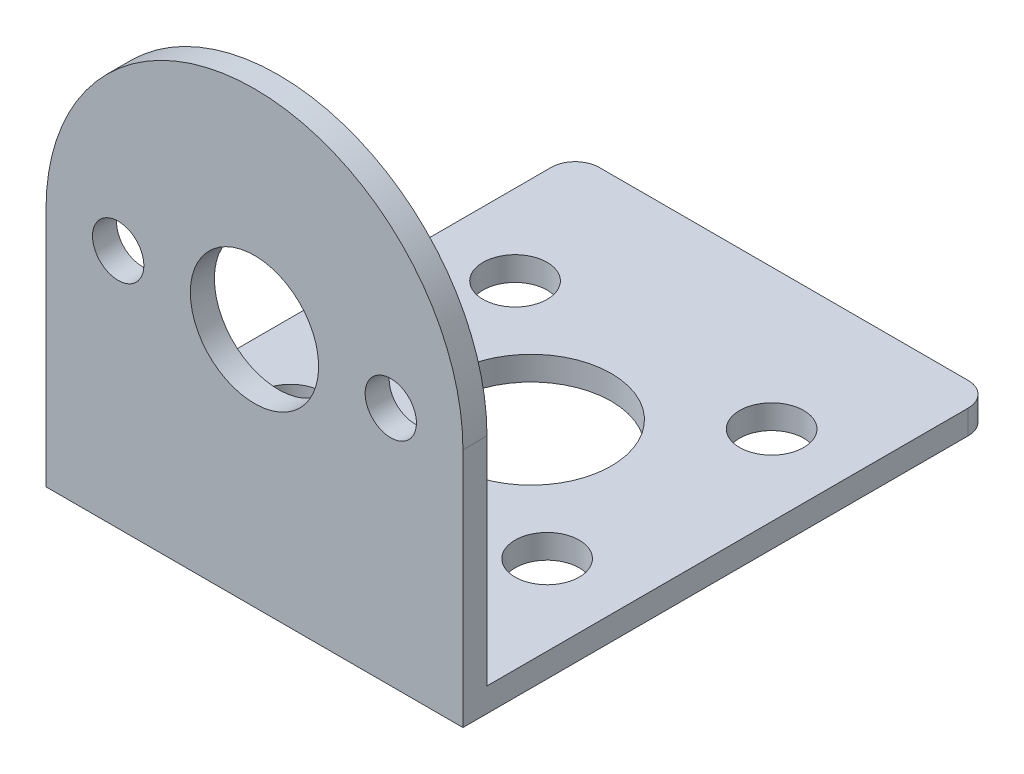
ISO-10303-21;
HEADER;
FILE_DESCRIPTION(('STEP AP214'),'2;1');
FILE_NAME('part.step','',(''),(''),'','','');
FILE_SCHEMA(('AUTOMOTIVE_DESIGN { 1 0 10303 214 1 1 1 1 }'));
ENDSEC;
DATA;
#1=APPLICATION_CONTEXT('core data for automotive mechanical design processes');
#2=APPLICATION_PROTOCOL_DEFINITION('international standard','automotive_design',2000,#1);
#3=PRODUCT_CONTEXT('',#1,'mechanical');
#4=PRODUCT('Part','Part','',(#3));
#5=PRODUCT_RELATED_PRODUCT_CATEGORY('part','',(#4));
#6=PRODUCT_DEFINITION_FORMATION('','',#4);
#7=PRODUCT_DEFINITION_CONTEXT('part definition',#1,'design');
#8=PRODUCT_DEFINITION('design','',#6,#7);
#9=PRODUCT_DEFINITION_SHAPE('','',#8);
#10=(LENGTH_UNIT() NAMED_UNIT(*) SI_UNIT(.MILLI.,.METRE.));
#11=(NAMED_UNIT(*) PLANE_ANGLE_UNIT() SI_UNIT($,.RADIAN.));
#12=(NAMED_UNIT(*) SI_UNIT($,.STERADIAN.) SOLID_ANGLE_UNIT());
#13=UNCERTAINTY_MEASURE_WITH_UNIT(LENGTH_MEASURE(1.E-05),#10,'distance_accuracy_value','');
#14=(GEOMETRIC_REPRESENTATION_CONTEXT(3) GLOBAL_UNCERTAINTY_ASSIGNED_CONTEXT((#13)) GLOBAL_UNIT_ASSIGNED_CONTEXT((#10,
#11,#12)) REPRESENTATION_CONTEXT('',''));
#15=CARTESIAN_POINT('',(0.,0.,0.));
#16=DIRECTION('',(0.,0.,1.));
#17=DIRECTION('',(1.,0.,0.));
#18=AXIS2_PLACEMENT_3D('',#15,#16,#17);
#19=CARTESIAN_POINT('',(13.,15.,0.));
#20=DIRECTION('',(0.,0.,1.));
#21=DIRECTION('',(1.,0.,0.));
#22=AXIS2_PLACEMENT_3D('',#19,#20,#21);
#23=PLANE('',#22);
#24=CARTESIAN_POINT('',(21.5,15.,0.));
#25=DIRECTION('',(0.,0.,-1.));
#26=DIRECTION('',(-1.,0.,0.));
#27=AXIS2_PLACEMENT_3D('',#24,#25,#26);
#28=CIRCLE('',#27,1.6);
#29=CARTESIAN_POINT('',(19.9,15.,0.));
#30=VERTEX_POINT('',#29);
#31=EDGE_CURVE('E146',#30,#30,#28,.T.);
#32=ORIENTED_EDGE('',*,*,#31,.F.);
#33=EDGE_LOOP('',(#32));
#34=FACE_BOUND('',#33,.T.);
#35=CARTESIAN_POINT('',(13.,15.,0.));
#36=DIRECTION('',(0.,0.,-1.));
#37=DIRECTION('',(-1.,0.,0.));
#38=AXIS2_PLACEMENT_3D('',#35,#36,#37);
#39=CIRCLE('',#38,4.);
#40=CARTESIAN_POINT('',(9.,15.,0.));
#41=VERTEX_POINT('',#40);
#42=EDGE_CURVE('E159',#41,#41,#39,.T.);
#43=ORIENTED_EDGE('',*,*,#42,.F.);
#44=EDGE_LOOP('',(#43));
#45=FACE_BOUND('',#44,.T.);
#46=CARTESIAN_POINT('',(4.5,15.,0.));
#47=DIRECTION('',(0.,0.,-1.));
#48=DIRECTION('',(-1.,0.,0.));
#49=AXIS2_PLACEMENT_3D('',#46,#47,#48);
#50=CIRCLE('',#49,1.6);
#51=CARTESIAN_POINT('',(2.9,15.,0.));
#52=VERTEX_POINT('',#51);
#53=EDGE_CURVE('E151',#52,#52,#50,.T.);
#54=ORIENTED_EDGE('',*,*,#53,.F.);
#55=EDGE_LOOP('',(#54));
#56=FACE_BOUND('',#55,.T.);
#57=DIRECTION('',(1.,0.,0.));
#58=VECTOR('',#57,1.);
#59=CARTESIAN_POINT('',(26.,1.5,0.));
#60=LINE('',#59,#58);
#61=CARTESIAN_POINT('',(0.,1.5,0.));
#62=VERTEX_POINT('',#61);
#63=CARTESIAN_POINT('',(26.,1.5,0.));
#64=VERTEX_POINT('',#63);
#65=EDGE_CURVE('E124',#62,#64,#60,.T.);
#66=ORIENTED_EDGE('',*,*,#65,.F.);
#67=DIRECTION('',(0.,-1.,0.));
#68=VECTOR('',#67,1.);
#69=CARTESIAN_POINT('',(0.,0.,0.));
#70=LINE('',#69,#68);
#71=CARTESIAN_POINT('',(0.,15.,0.));
#72=VERTEX_POINT('',#71);
#73=EDGE_CURVE('E128',#72,#62,#70,.T.);
#74=ORIENTED_EDGE('',*,*,#73,.F.);
#75=CARTESIAN_POINT('',(13.,15.,0.));
#76=DIRECTION('',(0.,0.,1.));
#77=DIRECTION('',(1.,0.,0.));
#78=AXIS2_PLACEMENT_3D('',#75,#76,#77);
#79=CIRCLE('',#78,13.);
#80=CARTESIAN_POINT('',(26.,15.,0.));
#81=VERTEX_POINT('',#80);
#82=EDGE_CURVE('E126',#81,#72,#79,.T.);
#83=ORIENTED_EDGE('',*,*,#82,.F.);
#84=DIRECTION('',(0.,1.,0.));
#85=VECTOR('',#84,1.);
#86=CARTESIAN_POINT('',(26.,0.,0.));
#87=LINE('',#86,#85);
#88=EDGE_CURVE('E112',#64,#81,#87,.T.);
#89=ORIENTED_EDGE('',*,*,#88,.F.);
#90=EDGE_LOOP('',(#66,#74,#83,#89));
#91=FACE_BOUND('',#90,.T.);
#92=ADVANCED_FACE('F45',(#34,#45,#56,#91),#23,.F.);
#93=CARTESIAN_POINT('',(0.,0.,1.5));
#94=DIRECTION('',(1.,0.,0.));
#95=DIRECTION('',(0.,0.,-1.));
#96=AXIS2_PLACEMENT_3D('',#93,#94,#95);
#97=PLANE('',#96);
#98=DIRECTION('',(0.,0.,1.));
#99=VECTOR('',#98,1.);
#100=CARTESIAN_POINT('',(0.,1.5,-31.5));
#101=LINE('',#100,#99);
#102=CARTESIAN_POINT('',(0.,1.5,-30.));
#103=VERTEX_POINT('',#102);
#104=EDGE_CURVE('E117',#103,#62,#101,.T.);
#105=ORIENTED_EDGE('',*,*,#104,.F.);
#106=DIRECTION('',(0.,1.,0.));
#107=VECTOR('',#106,1.);
#108=CARTESIAN_POINT('',(0.,0.,-30.));
#109=LINE('',#108,#107);
#110=CARTESIAN_POINT('',(0.,0.,-30.));
#111=VERTEX_POINT('',#110);
#112=EDGE_CURVE('E11',#103,#111,#109,.F.);
#113=ORIENTED_EDGE('',*,*,#112,.T.);
#114=DIRECTION('',(0.,0.,-1.));
#115=VECTOR('',#114,1.);
#116=CARTESIAN_POINT('',(0.,0.,1.5));
#117=LINE('',#116,#115);
#118=CARTESIAN_POINT('',(0.,0.,1.5));
#119=VERTEX_POINT('',#118);
#120=EDGE_CURVE('E197',#119,#111,#117,.T.);
#121=ORIENTED_EDGE('',*,*,#120,.F.);
#122=DIRECTION('',(0.,-1.,0.));
#123=VECTOR('',#122,1.);
#124=CARTESIAN_POINT('',(0.,0.,1.5));
#125=LINE('',#124,#123);
#126=CARTESIAN_POINT('',(0.,15.,1.5));
#127=VERTEX_POINT('',#126);
#128=EDGE_CURVE('E170',#127,#119,#125,.T.);
#129=ORIENTED_EDGE('',*,*,#128,.F.);
#130=DIRECTION('',(0.,0.,-1.));
#131=VECTOR('',#130,1.);
#132=CARTESIAN_POINT('',(0.,15.,1.5));
#133=LINE('',#132,#131);
#134=EDGE_CURVE('E183',#127,#72,#133,.T.);
#135=ORIENTED_EDGE('',*,*,#134,.T.);
#136=ORIENTED_EDGE('',*,*,#73,.T.);
#137=EDGE_LOOP('',(#105,#113,#121,#129,#135,#136));
#138=FACE_BOUND('',#137,.T.);
#139=ADVANCED_FACE('F258',(#138),#97,.F.);
#140=CARTESIAN_POINT('',(0.,0.,1.5));
#141=DIRECTION('',(0.,1.,0.));
#142=DIRECTION('',(0.,0.,1.));
#143=AXIS2_PLACEMENT_3D('',#140,#141,#142);
#144=PLANE('',#143);
#145=CARTESIAN_POINT('',(5.,0.,-22.75));
#146=DIRECTION('',(0.,-1.,0.));
#147=DIRECTION('',(0.,0.,1.));
#148=AXIS2_PLACEMENT_3D('',#145,#146,#147);
#149=CIRCLE('',#148,2.);
#150=CARTESIAN_POINT('',(5.,0.,-24.75));
#151=VERTEX_POINT('',#150);
#152=EDGE_CURVE('E342',#151,#151,#149,.T.);
#153=ORIENTED_EDGE('',*,*,#152,.F.);
#154=EDGE_LOOP('',(#153));
#155=FACE_BOUND('',#154,.T.);
#156=CARTESIAN_POINT('',(13.,0.,-15.75));
#157=DIRECTION('',(0.,-1.,0.));
#158=DIRECTION('',(0.,0.,-1.));
#159=AXIS2_PLACEMENT_3D('',#156,#157,#158);
#160=CIRCLE('',#159,5.);
#161=CARTESIAN_POINT('',(13.,0.,-20.75));
#162=VERTEX_POINT('',#161);
#163=EDGE_CURVE('E336',#162,#162,#160,.T.);
#164=ORIENTED_EDGE('',*,*,#163,.F.);
#165=EDGE_LOOP('',(#164));
#166=FACE_BOUND('',#165,.T.);
#167=CARTESIAN_POINT('',(21.,0.,-22.75));
#168=DIRECTION('',(0.,-1.,0.));
#169=DIRECTION('',(0.,0.,1.));
#170=AXIS2_PLACEMENT_3D('',#167,#168,#169);
#171=CIRCLE('',#170,2.);
#172=CARTESIAN_POINT('',(21.,0.,-24.75));
#173=VERTEX_POINT('',#172);
#174=EDGE_CURVE('E329',#173,#173,#171,.T.);
#175=ORIENTED_EDGE('',*,*,#174,.F.);
#176=EDGE_LOOP('',(#175));
#177=FACE_BOUND('',#176,.T.);
#178=CARTESIAN_POINT('',(21.,0.,-8.75));
#179=DIRECTION('',(0.,-1.,0.));
#180=DIRECTION('',(0.,0.,-1.));
#181=AXIS2_PLACEMENT_3D('',#178,#179,#180);
#182=CIRCLE('',#181,2.);
#183=CARTESIAN_POINT('',(21.,0.,-10.75));
#184=VERTEX_POINT('',#183);
#185=EDGE_CURVE('E321',#184,#184,#182,.T.);
#186=ORIENTED_EDGE('',*,*,#185,.F.);
#187=EDGE_LOOP('',(#186));
#188=FACE_BOUND('',#187,.T.);
#189=CARTESIAN_POINT('',(5.,0.,-8.75));
#190=DIRECTION('',(0.,-1.,0.));
#191=DIRECTION('',(0.,0.,-1.));
#192=AXIS2_PLACEMENT_3D('',#189,#190,#191);
#193=CIRCLE('',#192,2.);
#194=CARTESIAN_POINT('',(5.,0.,-10.75));
#195=VERTEX_POINT('',#194);
#196=EDGE_CURVE('E207',#195,#195,#193,.T.);
#197=ORIENTED_EDGE('',*,*,#196,.F.);
#198=EDGE_LOOP('',(#197));
#199=FACE_BOUND('',#198,.T.);
#200=DIRECTION('',(-1.,0.,0.));
#201=VECTOR('',#200,1.);
#202=CARTESIAN_POINT('',(26.,0.,-31.5));
#203=LINE('',#202,#201);
#204=CARTESIAN_POINT('',(24.5,0.,-31.5));
#205=VERTEX_POINT('',#204);
#206=CARTESIAN_POINT('',(1.5,0.,-31.5));
#207=VERTEX_POINT('',#206);
#208=EDGE_CURVE('E132',#205,#207,#203,.T.);
#209=ORIENTED_EDGE('',*,*,#208,.F.);
#210=CARTESIAN_POINT('',(24.5,0.,-30.));
#211=DIRECTION('',(0.,1.,0.));
#212=DIRECTION('',(0.,0.,1.));
#213=AXIS2_PLACEMENT_3D('',#210,#211,#212);
#214=CIRCLE('',#213,1.5);
#215=CARTESIAN_POINT('',(26.,0.,-30.));
#216=VERTEX_POINT('',#215);
#217=EDGE_CURVE('E228',#205,#216,#214,.F.);
#218=ORIENTED_EDGE('',*,*,#217,.T.);
#219=DIRECTION('',(0.,0.,-1.));
#220=VECTOR('',#219,1.);
#221=CARTESIAN_POINT('',(26.,0.,1.5));
#222=LINE('',#221,#220);
#223=CARTESIAN_POINT('',(26.,0.,1.5));
#224=VERTEX_POINT('',#223);
#225=EDGE_CURVE('E194',#224,#216,#222,.T.);
#226=ORIENTED_EDGE('',*,*,#225,.F.);
#227=DIRECTION('',(1.,0.,0.));
#228=VECTOR('',#227,1.);
#229=CARTESIAN_POINT('',(0.,0.,1.5));
#230=LINE('',#229,#228);
#231=EDGE_CURVE('E174',#119,#224,#230,.T.);
#232=ORIENTED_EDGE('',*,*,#231,.F.);
#233=ORIENTED_EDGE('',*,*,#120,.T.);
#234=CARTESIAN_POINT('',(1.5,0.,-30.));
#235=DIRECTION('',(0.,1.,0.));
#236=DIRECTION('',(0.,0.,1.));
#237=AXIS2_PLACEMENT_3D('',#234,#235,#236);
#238=CIRCLE('',#237,1.5);
#239=EDGE_CURVE('E225',#111,#207,#238,.F.);
#240=ORIENTED_EDGE('',*,*,#239,.T.);
#241=EDGE_LOOP('',(#209,#218,#226,#232,#233,#240));
#242=FACE_BOUND('',#241,.T.);
#243=ADVANCED_FACE('F246',(#155,#166,#177,#188,#199,#242),#144,.F.);
#244=CARTESIAN_POINT('',(26.,0.,1.5));
#245=DIRECTION('',(-1.,0.,0.));
#246=DIRECTION('',(0.,0.,1.));
#247=AXIS2_PLACEMENT_3D('',#244,#245,#246);
#248=PLANE('',#247);
#249=ORIENTED_EDGE('',*,*,#225,.T.);
#250=DIRECTION('',(0.,-1.,0.));
#251=VECTOR('',#250,1.);
#252=CARTESIAN_POINT('',(26.,0.,-30.));
#253=LINE('',#252,#251);
#254=CARTESIAN_POINT('',(26.,1.5,-30.));
#255=VERTEX_POINT('',#254);
#256=EDGE_CURVE('E69',#216,#255,#253,.F.);
#257=ORIENTED_EDGE('',*,*,#256,.T.);
#258=DIRECTION('',(0.,0.,1.));
#259=VECTOR('',#258,1.);
#260=CARTESIAN_POINT('',(26.,1.5,-31.5));
#261=LINE('',#260,#259);
#262=EDGE_CURVE('E108',#255,#64,#261,.T.);
#263=ORIENTED_EDGE('',*,*,#262,.T.);
#264=ORIENTED_EDGE('',*,*,#88,.T.);
#265=DIRECTION('',(0.,0.,-1.));
#266=VECTOR('',#265,1.);
#267=CARTESIAN_POINT('',(26.,15.,1.5));
#268=LINE('',#267,#266);
#269=CARTESIAN_POINT('',(26.,15.,1.5));
#270=VERTEX_POINT('',#269);
#271=EDGE_CURVE('E191',#270,#81,#268,.T.);
#272=ORIENTED_EDGE('',*,*,#271,.F.);
#273=DIRECTION('',(0.,1.,0.));
#274=VECTOR('',#273,1.);
#275=CARTESIAN_POINT('',(26.,0.,1.5));
#276=LINE('',#275,#274);
#277=EDGE_CURVE('E177',#224,#270,#276,.T.);
#278=ORIENTED_EDGE('',*,*,#277,.F.);
#279=EDGE_LOOP('',(#249,#257,#263,#264,#272,#278));
#280=FACE_BOUND('',#279,.T.);
#281=ADVANCED_FACE('F110',(#280),#248,.F.);
#282=CARTESIAN_POINT('',(13.,15.,1.5));
#283=DIRECTION('',(0.,0.,-1.));
#284=DIRECTION('',(-1.,0.,0.));
#285=AXIS2_PLACEMENT_3D('',#282,#283,#284);
#286=CYLINDRICAL_SURFACE('',#285,13.);
#287=ORIENTED_EDGE('',*,*,#82,.T.);
#288=ORIENTED_EDGE('',*,*,#134,.F.);
#289=CARTESIAN_POINT('',(13.,15.,1.5));
#290=DIRECTION('',(0.,0.,1.));
#291=DIRECTION('',(1.,0.,0.));
#292=AXIS2_PLACEMENT_3D('',#289,#290,#291);
#293=CIRCLE('',#292,13.);
#294=EDGE_CURVE('E180',#270,#127,#293,.T.);
#295=ORIENTED_EDGE('',*,*,#294,.F.);
#296=ORIENTED_EDGE('',*,*,#271,.T.);
#297=EDGE_LOOP('',(#287,#288,#295,#296));
#298=FACE_BOUND('',#297,.T.);
#299=ADVANCED_FACE('F260',(#298),#286,.T.);
#300=CARTESIAN_POINT('',(13.,15.,1.5));
#301=DIRECTION('',(0.,0.,1.));
#302=DIRECTION('',(1.,0.,0.));
#303=AXIS2_PLACEMENT_3D('',#300,#301,#302);
#304=PLANE('',#303);
#305=CARTESIAN_POINT('',(4.5,15.,1.5));
#306=DIRECTION('',(0.,0.,-1.));
#307=DIRECTION('',(-1.,0.,0.));
#308=AXIS2_PLACEMENT_3D('',#305,#306,#307);
#309=CIRCLE('',#308,1.6);
#310=CARTESIAN_POINT('',(2.9,15.,1.5));
#311=VERTEX_POINT('',#310);
#312=EDGE_CURVE('E147',#311,#311,#309,.T.);
#313=ORIENTED_EDGE('',*,*,#312,.T.);
#314=EDGE_LOOP('',(#313));
#315=FACE_BOUND('',#314,.T.);
#316=CARTESIAN_POINT('',(13.,15.,1.5));
#317=DIRECTION('',(0.,0.,-1.));
#318=DIRECTION('',(-1.,0.,0.));
#319=AXIS2_PLACEMENT_3D('',#316,#317,#318);
#320=CIRCLE('',#319,4.);
#321=CARTESIAN_POINT('',(9.,15.,1.5));
#322=VERTEX_POINT('',#321);
#323=EDGE_CURVE('E155',#322,#322,#320,.T.);
#324=ORIENTED_EDGE('',*,*,#323,.T.);
#325=EDGE_LOOP('',(#324));
#326=FACE_BOUND('',#325,.T.);
#327=CARTESIAN_POINT('',(21.5,15.,1.5));
#328=DIRECTION('',(0.,0.,-1.));
#329=DIRECTION('',(-1.,0.,0.));
#330=AXIS2_PLACEMENT_3D('',#327,#328,#329);
#331=CIRCLE('',#330,1.6);
#332=CARTESIAN_POINT('',(19.9,15.,1.5));
#333=VERTEX_POINT('',#332);
#334=EDGE_CURVE('E163',#333,#333,#331,.T.);
#335=ORIENTED_EDGE('',*,*,#334,.T.);
#336=EDGE_LOOP('',(#335));
#337=FACE_BOUND('',#336,.T.);
#338=ORIENTED_EDGE('',*,*,#128,.T.);
#339=ORIENTED_EDGE('',*,*,#231,.T.);
#340=ORIENTED_EDGE('',*,*,#277,.T.);
#341=ORIENTED_EDGE('',*,*,#294,.T.);
#342=EDGE_LOOP('',(#338,#339,#340,#341));
#343=FACE_BOUND('',#342,.T.);
#344=ADVANCED_FACE('F250',(#315,#326,#337,#343),#304,.T.);
#345=CARTESIAN_POINT('',(21.5,15.,1.5));
#346=DIRECTION('',(0.,0.,-1.));
#347=DIRECTION('',(-1.,0.,0.));
#348=AXIS2_PLACEMENT_3D('',#345,#346,#347);
#349=CYLINDRICAL_SURFACE('',#348,1.6);
#350=ORIENTED_EDGE('',*,*,#334,.F.);
#351=EDGE_LOOP('',(#350));
#352=FACE_BOUND('',#351,.T.);
#353=ORIENTED_EDGE('',*,*,#31,.T.);
#354=EDGE_LOOP('',(#353));
#355=FACE_BOUND('',#354,.T.);
#356=ADVANCED_FACE('F267',(#352,#355),#349,.F.);
#357=CARTESIAN_POINT('',(13.,15.,1.5));
#358=DIRECTION('',(0.,0.,-1.));
#359=DIRECTION('',(-1.,0.,0.));
#360=AXIS2_PLACEMENT_3D('',#357,#358,#359);
#361=CYLINDRICAL_SURFACE('',#360,4.);
#362=ORIENTED_EDGE('',*,*,#323,.F.);
#363=EDGE_LOOP('',(#362));
#364=FACE_BOUND('',#363,.T.);
#365=ORIENTED_EDGE('',*,*,#42,.T.);
#366=EDGE_LOOP('',(#365));
#367=FACE_BOUND('',#366,.T.);
#368=ADVANCED_FACE('F283',(#364,#367),#361,.F.);
#369=CARTESIAN_POINT('',(4.5,15.,1.5));
#370=DIRECTION('',(0.,0.,-1.));
#371=DIRECTION('',(-1.,0.,0.));
#372=AXIS2_PLACEMENT_3D('',#369,#370,#371);
#373=CYLINDRICAL_SURFACE('',#372,1.6);
#374=ORIENTED_EDGE('',*,*,#312,.F.);
#375=EDGE_LOOP('',(#374));
#376=FACE_BOUND('',#375,.T.);
#377=ORIENTED_EDGE('',*,*,#53,.T.);
#378=EDGE_LOOP('',(#377));
#379=FACE_BOUND('',#378,.T.);
#380=ADVANCED_FACE('F287',(#376,#379),#373,.F.);
#381=CARTESIAN_POINT('',(26.,1.5,-31.5));
#382=DIRECTION('',(0.,-1.,0.));
#383=DIRECTION('',(1.,0.,0.));
#384=AXIS2_PLACEMENT_3D('',#381,#382,#383);
#385=PLANE('',#384);
#386=CARTESIAN_POINT('',(5.,1.5,-22.75));
#387=DIRECTION('',(0.,-1.,0.));
#388=DIRECTION('',(1.,0.,0.));
#389=AXIS2_PLACEMENT_3D('',#386,#387,#388);
#390=CIRCLE('',#389,2.);
#391=CARTESIAN_POINT('',(5.,1.5,-24.75));
#392=VERTEX_POINT('',#391);
#393=EDGE_CURVE('E133',#392,#392,#390,.T.);
#394=ORIENTED_EDGE('',*,*,#393,.T.);
#395=EDGE_LOOP('',(#394));
#396=FACE_BOUND('',#395,.T.);
#397=CARTESIAN_POINT('',(13.,1.5,-15.75));
#398=DIRECTION('',(0.,-1.,0.));
#399=DIRECTION('',(1.,0.,0.));
#400=AXIS2_PLACEMENT_3D('',#397,#398,#399);
#401=CIRCLE('',#400,5.);
#402=CARTESIAN_POINT('',(13.,1.5,-20.75));
#403=VERTEX_POINT('',#402);
#404=EDGE_CURVE('E140',#403,#403,#401,.T.);
#405=ORIENTED_EDGE('',*,*,#404,.T.);
#406=EDGE_LOOP('',(#405));
#407=FACE_BOUND('',#406,.T.);
#408=CARTESIAN_POINT('',(21.,1.5,-22.75));
#409=DIRECTION('',(0.,-1.,0.));
#410=DIRECTION('',(1.,0.,0.));
#411=AXIS2_PLACEMENT_3D('',#408,#409,#410);
#412=CIRCLE('',#411,2.);
#413=CARTESIAN_POINT('',(21.,1.5,-24.75));
#414=VERTEX_POINT('',#413);
#415=EDGE_CURVE('E211',#414,#414,#412,.T.);
#416=ORIENTED_EDGE('',*,*,#415,.T.);
#417=EDGE_LOOP('',(#416));
#418=FACE_BOUND('',#417,.T.);
#419=CARTESIAN_POINT('',(21.,1.5,-8.75));
#420=DIRECTION('',(0.,-1.,0.));
#421=DIRECTION('',(1.,0.,0.));
#422=AXIS2_PLACEMENT_3D('',#419,#420,#421);
#423=CIRCLE('',#422,2.);
#424=CARTESIAN_POINT('',(21.,1.5,-10.75));
#425=VERTEX_POINT('',#424);
#426=EDGE_CURVE('E206',#425,#425,#423,.T.);
#427=ORIENTED_EDGE('',*,*,#426,.T.);
#428=EDGE_LOOP('',(#427));
#429=FACE_BOUND('',#428,.T.);
#430=CARTESIAN_POINT('',(5.,1.5,-8.75));
#431=DIRECTION('',(0.,-1.,0.));
#432=DIRECTION('',(1.,0.,0.));
#433=AXIS2_PLACEMENT_3D('',#430,#431,#432);
#434=CIRCLE('',#433,2.);
#435=CARTESIAN_POINT('',(5.,1.5,-10.75));
#436=VERTEX_POINT('',#435);
#437=EDGE_CURVE('E202',#436,#436,#434,.T.);
#438=ORIENTED_EDGE('',*,*,#437,.T.);
#439=EDGE_LOOP('',(#438));
#440=FACE_BOUND('',#439,.T.);
#441=ORIENTED_EDGE('',*,*,#262,.F.);
#442=CARTESIAN_POINT('',(24.5,1.5,-30.));
#443=DIRECTION('',(0.,-1.,0.));
#444=DIRECTION('',(1.,0.,0.));
#445=AXIS2_PLACEMENT_3D('',#442,#443,#444);
#446=CIRCLE('',#445,1.5);
#447=CARTESIAN_POINT('',(24.5,1.5,-31.5));
#448=VERTEX_POINT('',#447);
#449=EDGE_CURVE('E54',#255,#448,#446,.F.);
#450=ORIENTED_EDGE('',*,*,#449,.T.);
#451=DIRECTION('',(1.,0.,0.));
#452=VECTOR('',#451,1.);
#453=CARTESIAN_POINT('',(26.,1.5,-31.5));
#454=LINE('',#453,#452);
#455=CARTESIAN_POINT('',(1.5,1.5,-31.5));
#456=VERTEX_POINT('',#455);
#457=EDGE_CURVE('E118',#456,#448,#454,.T.);
#458=ORIENTED_EDGE('',*,*,#457,.F.);
#459=CARTESIAN_POINT('',(1.5,1.5,-30.));
#460=DIRECTION('',(0.,-1.,0.));
#461=DIRECTION('',(1.,0.,0.));
#462=AXIS2_PLACEMENT_3D('',#459,#460,#461);
#463=CIRCLE('',#462,1.5);
#464=EDGE_CURVE('E61',#456,#103,#463,.F.);
#465=ORIENTED_EDGE('',*,*,#464,.T.);
#466=ORIENTED_EDGE('',*,*,#104,.T.);
#467=ORIENTED_EDGE('',*,*,#65,.T.);
#468=EDGE_LOOP('',(#441,#450,#458,#465,#466,#467));
#469=FACE_BOUND('',#468,.T.);
#470=ADVANCED_FACE('F130',(#396,#407,#418,#429,#440,#469),#385,.F.);
#471=CARTESIAN_POINT('',(0.,0.,-31.5));
#472=DIRECTION('',(0.,0.,1.));
#473=DIRECTION('',(1.,0.,0.));
#474=AXIS2_PLACEMENT_3D('',#471,#472,#473);
#475=PLANE('',#474);
#476=ORIENTED_EDGE('',*,*,#457,.T.);
#477=DIRECTION('',(0.,-1.,0.));
#478=VECTOR('',#477,1.);
#479=CARTESIAN_POINT('',(24.5,0.,-31.5));
#480=LINE('',#479,#478);
#481=EDGE_CURVE('E221',#448,#205,#480,.T.);
#482=ORIENTED_EDGE('',*,*,#481,.T.);
#483=ORIENTED_EDGE('',*,*,#208,.T.);
#484=DIRECTION('',(0.,1.,0.));
#485=VECTOR('',#484,1.);
#486=CARTESIAN_POINT('',(1.5,0.,-31.5));
#487=LINE('',#486,#485);
#488=EDGE_CURVE('E201',#207,#456,#487,.T.);
#489=ORIENTED_EDGE('',*,*,#488,.T.);
#490=EDGE_LOOP('',(#476,#482,#483,#489));
#491=FACE_BOUND('',#490,.T.);
#492=ADVANCED_FACE('F239',(#491),#475,.F.);
#493=CARTESIAN_POINT('',(5.,28.,-8.75));
#494=DIRECTION('',(0.,-1.,0.));
#495=DIRECTION('',(0.,0.,-1.));
#496=AXIS2_PLACEMENT_3D('',#493,#494,#495);
#497=CYLINDRICAL_SURFACE('',#496,2.);
#498=CARTESIAN_POINT('',(5.,0.,-10.75));
#499=CARTESIAN_POINT('',(5.,0.0156250000000041,-10.75));
#500=CARTESIAN_POINT('',(5.,0.0312500000000046,-10.75));
#501=CARTESIAN_POINT('',(5.,0.0625000000000047,-10.75));
#502=CARTESIAN_POINT('',(5.,0.0781250000000041,-10.75));
#503=CARTESIAN_POINT('',(5.,0.109375000000003,-10.75));
#504=CARTESIAN_POINT('',(5.,0.125000000000002,-10.75));
#505=CARTESIAN_POINT('',(5.,0.156250000000002,-10.75));
#506=CARTESIAN_POINT('',(5.,0.171875000000003,-10.75));
#507=CARTESIAN_POINT('',(5.,0.203125000000004,-10.75));
#508=CARTESIAN_POINT('',(5.,0.218750000000005,-10.75));
#509=CARTESIAN_POINT('',(5.,0.250000000000005,-10.75));
#510=CARTESIAN_POINT('',(5.,0.265625000000004,-10.75));
#511=CARTESIAN_POINT('',(5.,0.296875000000003,-10.75));
#512=CARTESIAN_POINT('',(5.,0.312500000000003,-10.75));
#513=CARTESIAN_POINT('',(5.,0.343750000000003,-10.75));
#514=CARTESIAN_POINT('',(5.,0.359375000000003,-10.75));
#515=CARTESIAN_POINT('',(5.,0.390625000000004,-10.75));
#516=CARTESIAN_POINT('',(5.,0.406250000000005,-10.75));
#517=CARTESIAN_POINT('',(5.,0.437500000000005,-10.75));
#518=CARTESIAN_POINT('',(5.,0.453125000000004,-10.75));
#519=CARTESIAN_POINT('',(5.,0.484375000000003,-10.75));
#520=CARTESIAN_POINT('',(5.,0.500000000000003,-10.75));
#521=CARTESIAN_POINT('',(5.,0.531250000000003,-10.75));
#522=CARTESIAN_POINT('',(5.,0.546875000000003,-10.75));
#523=CARTESIAN_POINT('',(5.,0.578125000000005,-10.75));
#524=CARTESIAN_POINT('',(5.,0.593750000000005,-10.75));
#525=CARTESIAN_POINT('',(5.,0.625000000000005,-10.75));
#526=CARTESIAN_POINT('',(5.,0.640625000000005,-10.75));
#527=CARTESIAN_POINT('',(5.,0.671875000000004,-10.75));
#528=CARTESIAN_POINT('',(5.,0.687500000000003,-10.75));
#529=CARTESIAN_POINT('',(5.,0.718750000000003,-10.75));
#530=CARTESIAN_POINT('',(5.,0.734375000000004,-10.75));
#531=CARTESIAN_POINT('',(5.,0.765625000000005,-10.75));
#532=CARTESIAN_POINT('',(5.,0.781250000000005,-10.75));
#533=CARTESIAN_POINT('',(5.,0.812500000000005,-10.75));
#534=CARTESIAN_POINT('',(5.,0.828125000000005,-10.75));
#535=CARTESIAN_POINT('',(5.,0.859375000000004,-10.75));
#536=CARTESIAN_POINT('',(5.,0.875000000000003,-10.75));
#537=CARTESIAN_POINT('',(5.,0.906250000000003,-10.75));
#538=CARTESIAN_POINT('',(5.,0.921875000000004,-10.75));
#539=CARTESIAN_POINT('',(5.,0.953125000000005,-10.75));
#540=CARTESIAN_POINT('',(5.,0.968750000000006,-10.75));
#541=CARTESIAN_POINT('',(5.,1.00000000000001,-10.75));
#542=CARTESIAN_POINT('',(5.,1.01562500000001,-10.75));
#543=CARTESIAN_POINT('',(5.,1.046875,-10.75));
#544=CARTESIAN_POINT('',(5.,1.0625,-10.75));
#545=CARTESIAN_POINT('',(5.,1.09375,-10.75));
#546=CARTESIAN_POINT('',(5.,1.109375,-10.75));
#547=CARTESIAN_POINT('',(5.,1.14062500000001,-10.75));
#548=CARTESIAN_POINT('',(5.,1.15625000000001,-10.75));
#549=CARTESIAN_POINT('',(5.,1.18750000000001,-10.75));
#550=CARTESIAN_POINT('',(5.,1.20312500000001,-10.75));
#551=CARTESIAN_POINT('',(5.,1.234375,-10.75));
#552=CARTESIAN_POINT('',(5.,1.25,-10.75));
#553=CARTESIAN_POINT('',(5.,1.28125,-10.75));
#554=CARTESIAN_POINT('',(5.,1.296875,-10.75));
#555=CARTESIAN_POINT('',(5.,1.32812500000001,-10.75));
#556=CARTESIAN_POINT('',(5.,1.34375000000001,-10.75));
#557=CARTESIAN_POINT('',(5.,1.37500000000001,-10.75));
#558=CARTESIAN_POINT('',(5.,1.39062500000001,-10.75));
#559=CARTESIAN_POINT('',(5.,1.421875,-10.75));
#560=CARTESIAN_POINT('',(5.,1.4375,-10.75));
#561=CARTESIAN_POINT('',(5.,1.46875,-10.75));
#562=CARTESIAN_POINT('',(5.,1.484375,-10.75));
#563=CARTESIAN_POINT('',(5.,1.5,-10.75));
#564=B_SPLINE_CURVE_WITH_KNOTS('',3,(#498,#499,#500,#501,#502,#503,#504,#505,#506,#507,#508,
#509,#510,#511,#512,#513,#514,#515,#516,#517,#518,#519,#520,#521,#522,#523,#524,#525,#526,#527,
#528,#529,#530,#531,#532,#533,#534,#535,#536,#537,#538,#539,#540,#541,#542,#543,#544,#545,#546,
#547,#548,#549,#550,#551,#552,#553,#554,#555,#556,#557,#558,#559,#560,#561,#562,#563),
.UNSPECIFIED.,.F.,.F.,(4,2,2,2,2,2,2,2,2,2,2,2,2,2,2,2,2,2,2,2,2,2,2,2,2,2,2,2,2,2,2,2,4),(0.,
0.0468750000000018,0.0937500000000001,0.140624999999998,0.1875,0.234375000000002,0.28125,
0.328124999999999,0.375,0.421875000000002,0.46875,0.515624999999999,0.5625,0.609375000000002,
0.656250000000001,0.703124999999999,0.750000000000001,0.796875000000002,0.843750000000001,
0.890624999999999,0.937500000000001,0.984375000000003,1.03125,1.078125,1.125,1.171875,1.21875,
1.265625,1.3125,1.359375,1.40625,1.453125,1.5),.UNSPECIFIED.);
#565=EDGE_CURVE('BSEAM297',#195,#436,#564,.T.);
#566=ORIENTED_EDGE('',*,*,#196,.T.);
#567=ORIENTED_EDGE('',*,*,#437,.F.);
#568=ORIENTED_EDGE('',*,*,#565,.T.);
#569=ORIENTED_EDGE('',*,*,#565,.F.);
#570=EDGE_LOOP('',(#566,#568,#567,#569));
#571=FACE_BOUND('',#570,.T.);
#572=ADVANCED_FACE('F297',(#571),#497,.F.);
#573=CARTESIAN_POINT('',(21.,28.,-8.75));
#574=DIRECTION('',(0.,-1.,0.));
#575=DIRECTION('',(0.,0.,-1.));
#576=AXIS2_PLACEMENT_3D('',#573,#574,#575);
#577=CYLINDRICAL_SURFACE('',#576,2.);
#578=CARTESIAN_POINT('',(21.,0.,-10.75));
#579=CARTESIAN_POINT('',(21.,0.0156250000000041,-10.75));
#580=CARTESIAN_POINT('',(21.,0.0312500000000046,-10.75));
#581=CARTESIAN_POINT('',(21.,0.0625000000000047,-10.75));
#582=CARTESIAN_POINT('',(21.,0.0781250000000041,-10.75));
#583=CARTESIAN_POINT('',(21.,0.109375000000003,-10.75));
#584=CARTESIAN_POINT('',(21.,0.125000000000002,-10.75));
#585=CARTESIAN_POINT('',(21.,0.156250000000002,-10.75));
#586=CARTESIAN_POINT('',(21.,0.171875000000003,-10.75));
#587=CARTESIAN_POINT('',(21.,0.203125000000004,-10.75));
#588=CARTESIAN_POINT('',(21.,0.218750000000005,-10.75));
#589=CARTESIAN_POINT('',(21.,0.250000000000005,-10.75));
#590=CARTESIAN_POINT('',(21.,0.265625000000004,-10.75));
#591=CARTESIAN_POINT('',(21.,0.296875000000003,-10.75));
#592=CARTESIAN_POINT('',(21.,0.312500000000003,-10.75));
#593=CARTESIAN_POINT('',(21.,0.343750000000003,-10.75));
#594=CARTESIAN_POINT('',(21.,0.359375000000003,-10.75));
#595=CARTESIAN_POINT('',(21.,0.390625000000004,-10.75));
#596=CARTESIAN_POINT('',(21.,0.406250000000005,-10.75));
#597=CARTESIAN_POINT('',(21.,0.437500000000005,-10.75));
#598=CARTESIAN_POINT('',(21.,0.453125000000004,-10.75));
#599=CARTESIAN_POINT('',(21.,0.484375000000003,-10.75));
#600=CARTESIAN_POINT('',(21.,0.500000000000003,-10.75));
#601=CARTESIAN_POINT('',(21.,0.531250000000003,-10.75));
#602=CARTESIAN_POINT('',(21.,0.546875000000003,-10.75));
#603=CARTESIAN_POINT('',(21.,0.578125000000005,-10.75));
#604=CARTESIAN_POINT('',(21.,0.593750000000005,-10.75));
#605=CARTESIAN_POINT('',(21.,0.625000000000005,-10.75));
#606=CARTESIAN_POINT('',(21.,0.640625000000005,-10.75));
#607=CARTESIAN_POINT('',(21.,0.671875000000004,-10.75));
#608=CARTESIAN_POINT('',(21.,0.687500000000003,-10.75));
#609=CARTESIAN_POINT('',(21.,0.718750000000003,-10.75));
#610=CARTESIAN_POINT('',(21.,0.734375000000004,-10.75));
#611=CARTESIAN_POINT('',(21.,0.765625000000005,-10.75));
#612=CARTESIAN_POINT('',(21.,0.781250000000005,-10.75));
#613=CARTESIAN_POINT('',(21.,0.812500000000005,-10.75));
#614=CARTESIAN_POINT('',(21.,0.828125000000005,-10.75));
#615=CARTESIAN_POINT('',(21.,0.859375000000004,-10.75));
#616=CARTESIAN_POINT('',(21.,0.875000000000003,-10.75));
#617=CARTESIAN_POINT('',(21.,0.906250000000003,-10.75));
#618=CARTESIAN_POINT('',(21.,0.921875000000004,-10.75));
#619=CARTESIAN_POINT('',(21.,0.953125000000005,-10.75));
#620=CARTESIAN_POINT('',(21.,0.968750000000006,-10.75));
#621=CARTESIAN_POINT('',(21.,1.00000000000001,-10.75));
#622=CARTESIAN_POINT('',(21.,1.01562500000001,-10.75));
#623=CARTESIAN_POINT('',(21.,1.046875,-10.75));
#624=CARTESIAN_POINT('',(21.,1.0625,-10.75));
#625=CARTESIAN_POINT('',(21.,1.09375,-10.75));
#626=CARTESIAN_POINT('',(21.,1.109375,-10.75));
#627=CARTESIAN_POINT('',(21.,1.14062500000001,-10.75));
#628=CARTESIAN_POINT('',(21.,1.15625000000001,-10.75));
#629=CARTESIAN_POINT('',(21.,1.18750000000001,-10.75));
#630=CARTESIAN_POINT('',(21.,1.20312500000001,-10.75));
#631=CARTESIAN_POINT('',(21.,1.234375,-10.75));
#632=CARTESIAN_POINT('',(21.,1.25,-10.75));
#633=CARTESIAN_POINT('',(21.,1.28125,-10.75));
#634=CARTESIAN_POINT('',(21.,1.296875,-10.75));
#635=CARTESIAN_POINT('',(21.,1.32812500000001,-10.75));
#636=CARTESIAN_POINT('',(21.,1.34375000000001,-10.75));
#637=CARTESIAN_POINT('',(21.,1.37500000000001,-10.75));
#638=CARTESIAN_POINT('',(21.,1.39062500000001,-10.75));
#639=CARTESIAN_POINT('',(21.,1.421875,-10.75));
#640=CARTESIAN_POINT('',(21.,1.4375,-10.75));
#641=CARTESIAN_POINT('',(21.,1.46875,-10.75));
#642=CARTESIAN_POINT('',(21.,1.484375,-10.75));
#643=CARTESIAN_POINT('',(21.,1.5,-10.75));
#644=B_SPLINE_CURVE_WITH_KNOTS('',3,(#578,#579,#580,#581,#582,#583,#584,#585,#586,#587,#588,
#589,#590,#591,#592,#593,#594,#595,#596,#597,#598,#599,#600,#601,#602,#603,#604,#605,#606,#607,
#608,#609,#610,#611,#612,#613,#614,#615,#616,#617,#618,#619,#620,#621,#622,#623,#624,#625,#626,
#627,#628,#629,#630,#631,#632,#633,#634,#635,#636,#637,#638,#639,#640,#641,#642,#643),
.UNSPECIFIED.,.F.,.F.,(4,2,2,2,2,2,2,2,2,2,2,2,2,2,2,2,2,2,2,2,2,2,2,2,2,2,2,2,2,2,2,2,4),(0.,
0.0468750000000018,0.0937500000000001,0.140624999999998,0.1875,0.234375000000002,0.28125,
0.328124999999999,0.375,0.421875000000002,0.46875,0.515624999999999,0.5625,0.609375000000002,
0.656250000000001,0.703124999999999,0.750000000000001,0.796875000000002,0.843750000000001,
0.890624999999999,0.937500000000001,0.984375000000003,1.03125,1.078125,1.125,1.171875,1.21875,
1.265625,1.3125,1.359375,1.40625,1.453125,1.5),.UNSPECIFIED.);
#645=EDGE_CURVE('BSEAM300',#184,#425,#644,.T.);
#646=ORIENTED_EDGE('',*,*,#185,.T.);
#647=ORIENTED_EDGE('',*,*,#426,.F.);
#648=ORIENTED_EDGE('',*,*,#645,.T.);
#649=ORIENTED_EDGE('',*,*,#645,.F.);
#650=EDGE_LOOP('',(#646,#648,#647,#649));
#651=FACE_BOUND('',#650,.T.);
#652=ADVANCED_FACE('F300',(#651),#577,.F.);
#653=CARTESIAN_POINT('',(21.,28.,-22.75));
#654=DIRECTION('',(0.,-1.,0.));
#655=DIRECTION('',(0.,0.,-1.));
#656=AXIS2_PLACEMENT_3D('',#653,#654,#655);
#657=CYLINDRICAL_SURFACE('',#656,2.);
#658=CARTESIAN_POINT('',(21.,0.,-24.75));
#659=CARTESIAN_POINT('',(21.,0.0156250000000041,-24.75));
#660=CARTESIAN_POINT('',(21.,0.0312500000000046,-24.75));
#661=CARTESIAN_POINT('',(21.,0.0625000000000047,-24.75));
#662=CARTESIAN_POINT('',(21.,0.0781250000000041,-24.75));
#663=CARTESIAN_POINT('',(21.,0.109375000000003,-24.75));
#664=CARTESIAN_POINT('',(21.,0.125000000000002,-24.75));
#665=CARTESIAN_POINT('',(21.,0.156250000000002,-24.75));
#666=CARTESIAN_POINT('',(21.,0.171875000000003,-24.75));
#667=CARTESIAN_POINT('',(21.,0.203125000000004,-24.75));
#668=CARTESIAN_POINT('',(21.,0.218750000000005,-24.75));
#669=CARTESIAN_POINT('',(21.,0.250000000000005,-24.75));
#670=CARTESIAN_POINT('',(21.,0.265625000000004,-24.75));
#671=CARTESIAN_POINT('',(21.,0.296875000000003,-24.75));
#672=CARTESIAN_POINT('',(21.,0.312500000000003,-24.75));
#673=CARTESIAN_POINT('',(21.,0.343750000000003,-24.75));
#674=CARTESIAN_POINT('',(21.,0.359375000000003,-24.75));
#675=CARTESIAN_POINT('',(21.,0.390625000000004,-24.75));
#676=CARTESIAN_POINT('',(21.,0.406250000000005,-24.75));
#677=CARTESIAN_POINT('',(21.,0.437500000000005,-24.75));
#678=CARTESIAN_POINT('',(21.,0.453125000000004,-24.75));
#679=CARTESIAN_POINT('',(21.,0.484375000000003,-24.75));
#680=CARTESIAN_POINT('',(21.,0.500000000000003,-24.75));
#681=CARTESIAN_POINT('',(21.,0.531250000000003,-24.75));
#682=CARTESIAN_POINT('',(21.,0.546875000000003,-24.75));
#683=CARTESIAN_POINT('',(21.,0.578125000000005,-24.75));
#684=CARTESIAN_POINT('',(21.,0.593750000000005,-24.75));
#685=CARTESIAN_POINT('',(21.,0.625000000000005,-24.75));
#686=CARTESIAN_POINT('',(21.,0.640625000000005,-24.75));
#687=CARTESIAN_POINT('',(21.,0.671875000000004,-24.75));
#688=CARTESIAN_POINT('',(21.,0.687500000000003,-24.75));
#689=CARTESIAN_POINT('',(21.,0.718750000000003,-24.75));
#690=CARTESIAN_POINT('',(21.,0.734375000000004,-24.75));
#691=CARTESIAN_POINT('',(21.,0.765625000000005,-24.75));
#692=CARTESIAN_POINT('',(21.,0.781250000000005,-24.75));
#693=CARTESIAN_POINT('',(21.,0.812500000000005,-24.75));
#694=CARTESIAN_POINT('',(21.,0.828125000000005,-24.75));
#695=CARTESIAN_POINT('',(21.,0.859375000000004,-24.75));
#696=CARTESIAN_POINT('',(21.,0.875000000000003,-24.75));
#697=CARTESIAN_POINT('',(21.,0.906250000000003,-24.75));
#698=CARTESIAN_POINT('',(21.,0.921875000000004,-24.75));
#699=CARTESIAN_POINT('',(21.,0.953125000000005,-24.75));
#700=CARTESIAN_POINT('',(21.,0.968750000000006,-24.75));
#701=CARTESIAN_POINT('',(21.,1.00000000000001,-24.75));
#702=CARTESIAN_POINT('',(21.,1.01562500000001,-24.75));
#703=CARTESIAN_POINT('',(21.,1.046875,-24.75));
#704=CARTESIAN_POINT('',(21.,1.0625,-24.75));
#705=CARTESIAN_POINT('',(21.,1.09375,-24.75));
#706=CARTESIAN_POINT('',(21.,1.109375,-24.75));
#707=CARTESIAN_POINT('',(21.,1.14062500000001,-24.75));
#708=CARTESIAN_POINT('',(21.,1.15625000000001,-24.75));
#709=CARTESIAN_POINT('',(21.,1.18750000000001,-24.75));
#710=CARTESIAN_POINT('',(21.,1.20312500000001,-24.75));
#711=CARTESIAN_POINT('',(21.,1.234375,-24.75));
#712=CARTESIAN_POINT('',(21.,1.25,-24.75));
#713=CARTESIAN_POINT('',(21.,1.28125,-24.75));
#714=CARTESIAN_POINT('',(21.,1.296875,-24.75));
#715=CARTESIAN_POINT('',(21.,1.32812500000001,-24.75));
#716=CARTESIAN_POINT('',(21.,1.34375000000001,-24.75));
#717=CARTESIAN_POINT('',(21.,1.37500000000001,-24.75));
#718=CARTESIAN_POINT('',(21.,1.39062500000001,-24.75));
#719=CARTESIAN_POINT('',(21.,1.421875,-24.75));
#720=CARTESIAN_POINT('',(21.,1.4375,-24.75));
#721=CARTESIAN_POINT('',(21.,1.46875,-24.75));
#722=CARTESIAN_POINT('',(21.,1.484375,-24.75));
#723=CARTESIAN_POINT('',(21.,1.5,-24.75));
#724=B_SPLINE_CURVE_WITH_KNOTS('',3,(#658,#659,#660,#661,#662,#663,#664,#665,#666,#667,#668,
#669,#670,#671,#672,#673,#674,#675,#676,#677,#678,#679,#680,#681,#682,#683,#684,#685,#686,#687,
#688,#689,#690,#691,#692,#693,#694,#695,#696,#697,#698,#699,#700,#701,#702,#703,#704,#705,#706,
#707,#708,#709,#710,#711,#712,#713,#714,#715,#716,#717,#718,#719,#720,#721,#722,#723),
.UNSPECIFIED.,.F.,.F.,(4,2,2,2,2,2,2,2,2,2,2,2,2,2,2,2,2,2,2,2,2,2,2,2,2,2,2,2,2,2,2,2,4),(0.,
0.0468750000000018,0.0937500000000001,0.140624999999998,0.1875,0.234375000000002,0.28125,
0.328124999999999,0.375,0.421875000000002,0.46875,0.515624999999999,0.5625,0.609375000000002,
0.656250000000001,0.703124999999999,0.750000000000001,0.796875000000002,0.843750000000001,
0.890624999999999,0.937500000000001,0.984375000000003,1.03125,1.078125,1.125,1.171875,1.21875,
1.265625,1.3125,1.359375,1.40625,1.453125,1.5),.UNSPECIFIED.);
#725=EDGE_CURVE('BSEAM309',#173,#414,#724,.T.);
#726=ORIENTED_EDGE('',*,*,#174,.T.);
#727=ORIENTED_EDGE('',*,*,#415,.F.);
#728=ORIENTED_EDGE('',*,*,#725,.T.);
#729=ORIENTED_EDGE('',*,*,#725,.F.);
#730=EDGE_LOOP('',(#726,#728,#727,#729));
#731=FACE_BOUND('',#730,.T.);
#732=ADVANCED_FACE('F309',(#731),#657,.F.);
#733=CARTESIAN_POINT('',(13.,28.,-15.75));
#734=DIRECTION('',(0.,-1.,0.));
#735=DIRECTION('',(0.,0.,-1.));
#736=AXIS2_PLACEMENT_3D('',#733,#734,#735);
#737=CYLINDRICAL_SURFACE('',#736,5.);
#738=CARTESIAN_POINT('',(13.,0.,-20.75));
#739=CARTESIAN_POINT('',(13.,0.0156250000000041,-20.75));
#740=CARTESIAN_POINT('',(13.,0.0312500000000046,-20.75));
#741=CARTESIAN_POINT('',(13.,0.0625000000000047,-20.75));
#742=CARTESIAN_POINT('',(13.,0.0781250000000041,-20.75));
#743=CARTESIAN_POINT('',(13.,0.109375000000003,-20.75));
#744=CARTESIAN_POINT('',(13.,0.125000000000002,-20.75));
#745=CARTESIAN_POINT('',(13.,0.156250000000002,-20.75));
#746=CARTESIAN_POINT('',(13.,0.171875000000003,-20.75));
#747=CARTESIAN_POINT('',(13.,0.203125000000004,-20.75));
#748=CARTESIAN_POINT('',(13.,0.218750000000005,-20.75));
#749=CARTESIAN_POINT('',(13.,0.250000000000005,-20.75));
#750=CARTESIAN_POINT('',(13.,0.265625000000004,-20.75));
#751=CARTESIAN_POINT('',(13.,0.296875000000003,-20.75));
#752=CARTESIAN_POINT('',(13.,0.312500000000003,-20.75));
#753=CARTESIAN_POINT('',(13.,0.343750000000003,-20.75));
#754=CARTESIAN_POINT('',(13.,0.359375000000003,-20.75));
#755=CARTESIAN_POINT('',(13.,0.390625000000004,-20.75));
#756=CARTESIAN_POINT('',(13.,0.406250000000005,-20.75));
#757=CARTESIAN_POINT('',(13.,0.437500000000005,-20.75));
#758=CARTESIAN_POINT('',(13.,0.453125000000004,-20.75));
#759=CARTESIAN_POINT('',(13.,0.484375000000003,-20.75));
#760=CARTESIAN_POINT('',(13.,0.500000000000003,-20.75));
#761=CARTESIAN_POINT('',(13.,0.531250000000003,-20.75));
#762=CARTESIAN_POINT('',(13.,0.546875000000003,-20.75));
#763=CARTESIAN_POINT('',(13.,0.578125000000005,-20.75));
#764=CARTESIAN_POINT('',(13.,0.593750000000005,-20.75));
#765=CARTESIAN_POINT('',(13.,0.625000000000005,-20.75));
#766=CARTESIAN_POINT('',(13.,0.640625000000005,-20.75));
#767=CARTESIAN_POINT('',(13.,0.671875000000004,-20.75));
#768=CARTESIAN_POINT('',(13.,0.687500000000003,-20.75));
#769=CARTESIAN_POINT('',(13.,0.718750000000003,-20.75));
#770=CARTESIAN_POINT('',(13.,0.734375000000004,-20.75));
#771=CARTESIAN_POINT('',(13.,0.765625000000005,-20.75));
#772=CARTESIAN_POINT('',(13.,0.781250000000005,-20.75));
#773=CARTESIAN_POINT('',(13.,0.812500000000005,-20.75));
#774=CARTESIAN_POINT('',(13.,0.828125000000005,-20.75));
#775=CARTESIAN_POINT('',(13.,0.859375000000004,-20.75));
#776=CARTESIAN_POINT('',(13.,0.875000000000003,-20.75));
#777=CARTESIAN_POINT('',(13.,0.906250000000003,-20.75));
#778=CARTESIAN_POINT('',(13.,0.921875000000004,-20.75));
#779=CARTESIAN_POINT('',(13.,0.953125000000005,-20.75));
#780=CARTESIAN_POINT('',(13.,0.968750000000006,-20.75));
#781=CARTESIAN_POINT('',(13.,1.00000000000001,-20.75));
#782=CARTESIAN_POINT('',(13.,1.01562500000001,-20.75));
#783=CARTESIAN_POINT('',(13.,1.046875,-20.75));
#784=CARTESIAN_POINT('',(13.,1.0625,-20.75));
#785=CARTESIAN_POINT('',(13.,1.09375,-20.75));
#786=CARTESIAN_POINT('',(13.,1.109375,-20.75));
#787=CARTESIAN_POINT('',(13.,1.14062500000001,-20.75));
#788=CARTESIAN_POINT('',(13.,1.15625000000001,-20.75));
#789=CARTESIAN_POINT('',(13.,1.18750000000001,-20.75));
#790=CARTESIAN_POINT('',(13.,1.20312500000001,-20.75));
#791=CARTESIAN_POINT('',(13.,1.234375,-20.75));
#792=CARTESIAN_POINT('',(13.,1.25,-20.75));
#793=CARTESIAN_POINT('',(13.,1.28125,-20.75));
#794=CARTESIAN_POINT('',(13.,1.296875,-20.75));
#795=CARTESIAN_POINT('',(13.,1.32812500000001,-20.75));
#796=CARTESIAN_POINT('',(13.,1.34375000000001,-20.75));
#797=CARTESIAN_POINT('',(13.,1.37500000000001,-20.75));
#798=CARTESIAN_POINT('',(13.,1.39062500000001,-20.75));
#799=CARTESIAN_POINT('',(13.,1.421875,-20.75));
#800=CARTESIAN_POINT('',(13.,1.4375,-20.75));
#801=CARTESIAN_POINT('',(13.,1.46875,-20.75));
#802=CARTESIAN_POINT('',(13.,1.484375,-20.75));
#803=CARTESIAN_POINT('',(13.,1.5,-20.75));
#804=B_SPLINE_CURVE_WITH_KNOTS('',3,(#738,#739,#740,#741,#742,#743,#744,#745,#746,#747,#748,
#749,#750,#751,#752,#753,#754,#755,#756,#757,#758,#759,#760,#761,#762,#763,#764,#765,#766,#767,
#768,#769,#770,#771,#772,#773,#774,#775,#776,#777,#778,#779,#780,#781,#782,#783,#784,#785,#786,
#787,#788,#789,#790,#791,#792,#793,#794,#795,#796,#797,#798,#799,#800,#801,#802,#803),
.UNSPECIFIED.,.F.,.F.,(4,2,2,2,2,2,2,2,2,2,2,2,2,2,2,2,2,2,2,2,2,2,2,2,2,2,2,2,2,2,2,2,4),(0.,
0.0468750000000018,0.0937500000000001,0.140624999999998,0.1875,0.234375000000002,0.28125,
0.328124999999999,0.375,0.421875000000002,0.46875,0.515624999999999,0.5625,0.609375000000002,
0.656250000000001,0.703124999999999,0.750000000000001,0.796875000000002,0.843750000000001,
0.890624999999999,0.937500000000001,0.984375000000003,1.03125,1.078125,1.125,1.171875,1.21875,
1.265625,1.3125,1.359375,1.40625,1.453125,1.5),.UNSPECIFIED.);
#805=EDGE_CURVE('BSEAM305',#162,#403,#804,.T.);
#806=ORIENTED_EDGE('',*,*,#163,.T.);
#807=ORIENTED_EDGE('',*,*,#404,.F.);
#808=ORIENTED_EDGE('',*,*,#805,.T.);
#809=ORIENTED_EDGE('',*,*,#805,.F.);
#810=EDGE_LOOP('',(#806,#808,#807,#809));
#811=FACE_BOUND('',#810,.T.);
#812=ADVANCED_FACE('F305',(#811),#737,.F.);
#813=CARTESIAN_POINT('',(5.,28.,-22.75));
#814=DIRECTION('',(0.,-1.,0.));
#815=DIRECTION('',(0.,0.,-1.));
#816=AXIS2_PLACEMENT_3D('',#813,#814,#815);
#817=CYLINDRICAL_SURFACE('',#816,2.);
#818=CARTESIAN_POINT('',(5.,0.,-24.75));
#819=CARTESIAN_POINT('',(5.,0.0156250000000041,-24.75));
#820=CARTESIAN_POINT('',(5.,0.0312500000000046,-24.75));
#821=CARTESIAN_POINT('',(5.,0.0625000000000047,-24.75));
#822=CARTESIAN_POINT('',(5.,0.0781250000000041,-24.75));
#823=CARTESIAN_POINT('',(5.,0.109375000000003,-24.75));
#824=CARTESIAN_POINT('',(5.,0.125000000000002,-24.75));
#825=CARTESIAN_POINT('',(5.,0.156250000000002,-24.75));
#826=CARTESIAN_POINT('',(5.,0.171875000000003,-24.75));
#827=CARTESIAN_POINT('',(5.,0.203125000000004,-24.75));
#828=CARTESIAN_POINT('',(5.,0.218750000000005,-24.75));
#829=CARTESIAN_POINT('',(5.,0.250000000000005,-24.75));
#830=CARTESIAN_POINT('',(5.,0.265625000000004,-24.75));
#831=CARTESIAN_POINT('',(5.,0.296875000000003,-24.75));
#832=CARTESIAN_POINT('',(5.,0.312500000000003,-24.75));
#833=CARTESIAN_POINT('',(5.,0.343750000000003,-24.75));
#834=CARTESIAN_POINT('',(5.,0.359375000000003,-24.75));
#835=CARTESIAN_POINT('',(5.,0.390625000000004,-24.75));
#836=CARTESIAN_POINT('',(5.,0.406250000000005,-24.75));
#837=CARTESIAN_POINT('',(5.,0.437500000000005,-24.75));
#838=CARTESIAN_POINT('',(5.,0.453125000000004,-24.75));
#839=CARTESIAN_POINT('',(5.,0.484375000000003,-24.75));
#840=CARTESIAN_POINT('',(5.,0.500000000000003,-24.75));
#841=CARTESIAN_POINT('',(5.,0.531250000000003,-24.75));
#842=CARTESIAN_POINT('',(5.,0.546875000000003,-24.75));
#843=CARTESIAN_POINT('',(5.,0.578125000000005,-24.75));
#844=CARTESIAN_POINT('',(5.,0.593750000000005,-24.75));
#845=CARTESIAN_POINT('',(5.,0.625000000000005,-24.75));
#846=CARTESIAN_POINT('',(5.,0.640625000000005,-24.75));
#847=CARTESIAN_POINT('',(5.,0.671875000000004,-24.75));
#848=CARTESIAN_POINT('',(5.,0.687500000000003,-24.75));
#849=CARTESIAN_POINT('',(5.,0.718750000000003,-24.75));
#850=CARTESIAN_POINT('',(5.,0.734375000000004,-24.75));
#851=CARTESIAN_POINT('',(5.,0.765625000000005,-24.75));
#852=CARTESIAN_POINT('',(5.,0.781250000000005,-24.75));
#853=CARTESIAN_POINT('',(5.,0.812500000000005,-24.75));
#854=CARTESIAN_POINT('',(5.,0.828125000000005,-24.75));
#855=CARTESIAN_POINT('',(5.,0.859375000000004,-24.75));
#856=CARTESIAN_POINT('',(5.,0.875000000000003,-24.75));
#857=CARTESIAN_POINT('',(5.,0.906250000000003,-24.75));
#858=CARTESIAN_POINT('',(5.,0.921875000000004,-24.75));
#859=CARTESIAN_POINT('',(5.,0.953125000000005,-24.75));
#860=CARTESIAN_POINT('',(5.,0.968750000000006,-24.75));
#861=CARTESIAN_POINT('',(5.,1.00000000000001,-24.75));
#862=CARTESIAN_POINT('',(5.,1.01562500000001,-24.75));
#863=CARTESIAN_POINT('',(5.,1.046875,-24.75));
#864=CARTESIAN_POINT('',(5.,1.0625,-24.75));
#865=CARTESIAN_POINT('',(5.,1.09375,-24.75));
#866=CARTESIAN_POINT('',(5.,1.109375,-24.75));
#867=CARTESIAN_POINT('',(5.,1.14062500000001,-24.75));
#868=CARTESIAN_POINT('',(5.,1.15625000000001,-24.75));
#869=CARTESIAN_POINT('',(5.,1.18750000000001,-24.75));
#870=CARTESIAN_POINT('',(5.,1.20312500000001,-24.75));
#871=CARTESIAN_POINT('',(5.,1.234375,-24.75));
#872=CARTESIAN_POINT('',(5.,1.25,-24.75));
#873=CARTESIAN_POINT('',(5.,1.28125,-24.75));
#874=CARTESIAN_POINT('',(5.,1.296875,-24.75));
#875=CARTESIAN_POINT('',(5.,1.32812500000001,-24.75));
#876=CARTESIAN_POINT('',(5.,1.34375000000001,-24.75));
#877=CARTESIAN_POINT('',(5.,1.37500000000001,-24.75));
#878=CARTESIAN_POINT('',(5.,1.39062500000001,-24.75));
#879=CARTESIAN_POINT('',(5.,1.421875,-24.75));
#880=CARTESIAN_POINT('',(5.,1.4375,-24.75));
#881=CARTESIAN_POINT('',(5.,1.46875,-24.75));
#882=CARTESIAN_POINT('',(5.,1.484375,-24.75));
#883=CARTESIAN_POINT('',(5.,1.5,-24.75));
#884=B_SPLINE_CURVE_WITH_KNOTS('',3,(#818,#819,#820,#821,#822,#823,#824,#825,#826,#827,#828,
#829,#830,#831,#832,#833,#834,#835,#836,#837,#838,#839,#840,#841,#842,#843,#844,#845,#846,#847,
#848,#849,#850,#851,#852,#853,#854,#855,#856,#857,#858,#859,#860,#861,#862,#863,#864,#865,#866,
#867,#868,#869,#870,#871,#872,#873,#874,#875,#876,#877,#878,#879,#880,#881,#882,#883),
.UNSPECIFIED.,.F.,.F.,(4,2,2,2,2,2,2,2,2,2,2,2,2,2,2,2,2,2,2,2,2,2,2,2,2,2,2,2,2,2,2,2,4),(0.,
0.0468750000000018,0.0937500000000001,0.140624999999998,0.1875,0.234375000000002,0.28125,
0.328124999999999,0.375,0.421875000000002,0.46875,0.515624999999999,0.5625,0.609375000000002,
0.656250000000001,0.703124999999999,0.750000000000001,0.796875000000002,0.843750000000001,
0.890624999999999,0.937500000000001,0.984375000000003,1.03125,1.078125,1.125,1.171875,1.21875,
1.265625,1.3125,1.359375,1.40625,1.453125,1.5),.UNSPECIFIED.);
#885=EDGE_CURVE('BSEAM302',#151,#392,#884,.T.);
#886=ORIENTED_EDGE('',*,*,#152,.T.);
#887=ORIENTED_EDGE('',*,*,#393,.F.);
#888=ORIENTED_EDGE('',*,*,#885,.T.);
#889=ORIENTED_EDGE('',*,*,#885,.F.);
#890=EDGE_LOOP('',(#886,#888,#887,#889));
#891=FACE_BOUND('',#890,.T.);
#892=ADVANCED_FACE('F302',(#891),#817,.F.);
#893=CARTESIAN_POINT('',(24.5,0.,-30.));
#894=DIRECTION('',(0.,-1.,0.));
#895=DIRECTION('',(0.,0.,-1.));
#896=AXIS2_PLACEMENT_3D('',#893,#894,#895);
#897=CYLINDRICAL_SURFACE('',#896,1.5);
#898=ORIENTED_EDGE('',*,*,#449,.F.);
#899=ORIENTED_EDGE('',*,*,#256,.F.);
#900=ORIENTED_EDGE('',*,*,#217,.F.);
#901=ORIENTED_EDGE('',*,*,#481,.F.);
#902=EDGE_LOOP('',(#898,#899,#900,#901));
#903=FACE_BOUND('',#902,.T.);
#904=ADVANCED_FACE('F243',(#903),#897,.T.);
#905=CARTESIAN_POINT('',(1.5,0.,-30.));
#906=DIRECTION('',(0.,1.,0.));
#907=DIRECTION('',(0.,0.,1.));
#908=AXIS2_PLACEMENT_3D('',#905,#906,#907);
#909=CYLINDRICAL_SURFACE('',#908,1.5);
#910=ORIENTED_EDGE('',*,*,#239,.F.);
#911=ORIENTED_EDGE('',*,*,#112,.F.);
#912=ORIENTED_EDGE('',*,*,#464,.F.);
#913=ORIENTED_EDGE('',*,*,#488,.F.);
#914=EDGE_LOOP('',(#910,#911,#912,#913));
#915=FACE_BOUND('',#914,.T.);
#916=ADVANCED_FACE('F47',(#915),#909,.T.);
#917=CLOSED_SHELL('',(#92,#139,#243,#281,#299,#344,#356,#368,#380,#470,#492,#572,#652,#732,#812,
#892,#904,#916));
#918=MANIFOLD_SOLID_BREP('B2',#917);
#919=ADVANCED_BREP_SHAPE_REPRESENTATION('',(#18,#918),#14);
#920=SHAPE_DEFINITION_REPRESENTATION(#9,#919);
ENDSEC;
END-ISO-10303-21;
